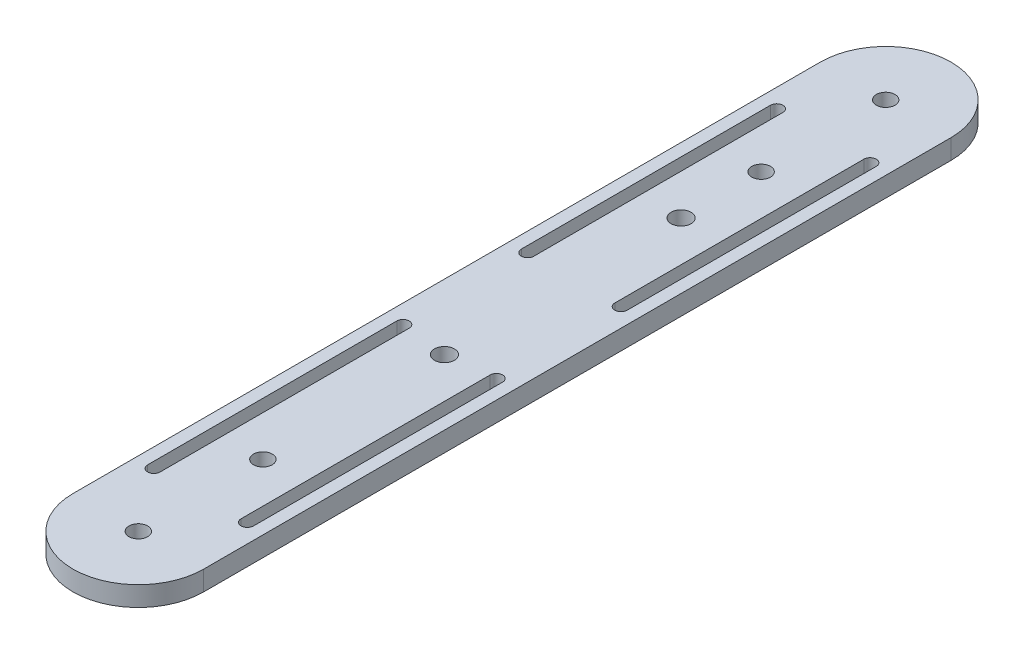
ISO-10303-21;
HEADER;
FILE_DESCRIPTION(('STEP AP214'),'2;1');
FILE_NAME('part.step','',(''),(''),'','','');
FILE_SCHEMA(('AUTOMOTIVE_DESIGN { 1 0 10303 214 1 1 1 1 }'));
ENDSEC;
DATA;
#1=APPLICATION_CONTEXT('core data for automotive mechanical design processes');
#2=APPLICATION_PROTOCOL_DEFINITION('international standard','automotive_design',2000,#1);
#3=PRODUCT_CONTEXT('',#1,'mechanical');
#4=PRODUCT('Part','Part','',(#3));
#5=PRODUCT_RELATED_PRODUCT_CATEGORY('part','',(#4));
#6=PRODUCT_DEFINITION_FORMATION('','',#4);
#7=PRODUCT_DEFINITION_CONTEXT('part definition',#1,'design');
#8=PRODUCT_DEFINITION('design','',#6,#7);
#9=PRODUCT_DEFINITION_SHAPE('','',#8);
#10=(LENGTH_UNIT() NAMED_UNIT(*) SI_UNIT(.MILLI.,.METRE.));
#11=(NAMED_UNIT(*) PLANE_ANGLE_UNIT() SI_UNIT($,.RADIAN.));
#12=(NAMED_UNIT(*) SI_UNIT($,.STERADIAN.) SOLID_ANGLE_UNIT());
#13=UNCERTAINTY_MEASURE_WITH_UNIT(LENGTH_MEASURE(1.E-05),#10,'distance_accuracy_value','');
#14=(GEOMETRIC_REPRESENTATION_CONTEXT(3) GLOBAL_UNCERTAINTY_ASSIGNED_CONTEXT((#13)) GLOBAL_UNIT_ASSIGNED_CONTEXT((#10,
#11,#12)) REPRESENTATION_CONTEXT('',''));
#15=CARTESIAN_POINT('',(0.,0.,0.));
#16=DIRECTION('',(0.,0.,1.));
#17=DIRECTION('',(1.,0.,0.));
#18=AXIS2_PLACEMENT_3D('',#15,#16,#17);
#19=CARTESIAN_POINT('',(0.,3.175,0.));
#20=DIRECTION('',(0.,1.,0.));
#21=DIRECTION('',(0.,0.,1.));
#22=AXIS2_PLACEMENT_3D('',#19,#20,#21);
#23=PLANE('',#22);
#24=CARTESIAN_POINT('',(0.,3.175,70.85));
#25=DIRECTION('',(0.,1.,0.));
#26=DIRECTION('',(0.,0.,1.));
#27=AXIS2_PLACEMENT_3D('',#24,#25,#26);
#28=CIRCLE('',#27,1.6);
#29=CARTESIAN_POINT('',(0.,3.175,72.45));
#30=VERTEX_POINT('',#29);
#31=EDGE_CURVE('E228',#30,#30,#28,.T.);
#32=ORIENTED_EDGE('',*,*,#31,.F.);
#33=EDGE_LOOP('',(#32));
#34=FACE_BOUND('',#33,.T.);
#35=CARTESIAN_POINT('',(0.,3.175,32.85));
#36=DIRECTION('',(0.,1.,0.));
#37=DIRECTION('',(0.,0.,1.));
#38=AXIS2_PLACEMENT_3D('',#35,#36,#37);
#39=CIRCLE('',#38,1.6);
#40=CARTESIAN_POINT('',(0.,3.175,34.45));
#41=VERTEX_POINT('',#40);
#42=EDGE_CURVE('E481',#41,#41,#39,.T.);
#43=ORIENTED_EDGE('',*,*,#42,.F.);
#44=EDGE_LOOP('',(#43));
#45=FACE_BOUND('',#44,.T.);
#46=CARTESIAN_POINT('',(-7.50000000000002,3.175,70.));
#47=DIRECTION('',(0.,1.,0.));
#48=DIRECTION('',(0.,0.,1.));
#49=AXIS2_PLACEMENT_3D('',#46,#47,#48);
#50=CIRCLE('',#49,0.999999999999999);
#51=CARTESIAN_POINT('',(-6.5,3.175,70.));
#52=VERTEX_POINT('',#51);
#53=CARTESIAN_POINT('',(-8.5,3.175,70.));
#54=VERTEX_POINT('',#53);
#55=EDGE_CURVE('E292',#52,#54,#50,.T.);
#56=ORIENTED_EDGE('',*,*,#55,.F.);
#57=DIRECTION('',(0.,0.,-1.));
#58=VECTOR('',#57,1.);
#59=CARTESIAN_POINT('',(-6.5,3.175,0.));
#60=LINE('',#59,#58);
#61=CARTESIAN_POINT('',(-6.5,3.175,110.));
#62=VERTEX_POINT('',#61);
#63=EDGE_CURVE('E286',#62,#52,#60,.T.);
#64=ORIENTED_EDGE('',*,*,#63,.F.);
#65=CARTESIAN_POINT('',(-7.50000000000013,3.175,110.));
#66=DIRECTION('',(0.,1.,0.));
#67=DIRECTION('',(0.,0.,1.));
#68=AXIS2_PLACEMENT_3D('',#65,#66,#67);
#69=CIRCLE('',#68,0.999999999999999);
#70=CARTESIAN_POINT('',(-8.50000000000013,3.175,110.));
#71=VERTEX_POINT('',#70);
#72=EDGE_CURVE('E288',#71,#62,#69,.T.);
#73=ORIENTED_EDGE('',*,*,#72,.F.);
#74=DIRECTION('',(0.,0.,1.));
#75=VECTOR('',#74,1.);
#76=CARTESIAN_POINT('',(-8.5,3.175,0.));
#77=LINE('',#76,#75);
#78=EDGE_CURVE('E290',#54,#71,#77,.T.);
#79=ORIENTED_EDGE('',*,*,#78,.F.);
#80=EDGE_LOOP('',(#56,#64,#73,#79));
#81=FACE_BOUND('',#80,.T.);
#82=CARTESIAN_POINT('',(7.49999999999986,3.175,110.));
#83=DIRECTION('',(0.,1.,0.));
#84=DIRECTION('',(0.,0.,1.));
#85=AXIS2_PLACEMENT_3D('',#82,#83,#84);
#86=CIRCLE('',#85,0.999999999999999);
#87=CARTESIAN_POINT('',(6.5,3.175,110.));
#88=VERTEX_POINT('',#87);
#89=CARTESIAN_POINT('',(8.5,3.175,110.));
#90=VERTEX_POINT('',#89);
#91=EDGE_CURVE('E284',#88,#90,#86,.T.);
#92=ORIENTED_EDGE('',*,*,#91,.F.);
#93=DIRECTION('',(0.,0.,1.));
#94=VECTOR('',#93,1.);
#95=CARTESIAN_POINT('',(6.5,3.175,0.));
#96=LINE('',#95,#94);
#97=CARTESIAN_POINT('',(6.5,3.175,70.));
#98=VERTEX_POINT('',#97);
#99=EDGE_CURVE('E278',#98,#88,#96,.T.);
#100=ORIENTED_EDGE('',*,*,#99,.F.);
#101=CARTESIAN_POINT('',(7.49999999999997,3.175,70.));
#102=DIRECTION('',(0.,1.,0.));
#103=DIRECTION('',(0.,0.,1.));
#104=AXIS2_PLACEMENT_3D('',#101,#102,#103);
#105=CIRCLE('',#104,0.999999999999999);
#106=CARTESIAN_POINT('',(8.5,3.175,70.));
#107=VERTEX_POINT('',#106);
#108=EDGE_CURVE('E280',#107,#98,#105,.T.);
#109=ORIENTED_EDGE('',*,*,#108,.F.);
#110=DIRECTION('',(0.,0.,-1.));
#111=VECTOR('',#110,1.);
#112=CARTESIAN_POINT('',(8.5,3.175,0.));
#113=LINE('',#112,#111);
#114=EDGE_CURVE('E282',#90,#107,#113,.T.);
#115=ORIENTED_EDGE('',*,*,#114,.F.);
#116=EDGE_LOOP('',(#92,#100,#109,#115));
#117=FACE_BOUND('',#116,.T.);
#118=CARTESIAN_POINT('',(7.5,3.175,50.));
#119=DIRECTION('',(0.,1.,0.));
#120=DIRECTION('',(0.,0.,1.));
#121=AXIS2_PLACEMENT_3D('',#118,#119,#120);
#122=CIRCLE('',#121,0.999999999999999);
#123=CARTESIAN_POINT('',(6.5,3.175,50.));
#124=VERTEX_POINT('',#123);
#125=CARTESIAN_POINT('',(8.5,3.175,50.));
#126=VERTEX_POINT('',#125);
#127=EDGE_CURVE('E276',#124,#126,#122,.T.);
#128=ORIENTED_EDGE('',*,*,#127,.F.);
#129=DIRECTION('',(0.,0.,1.));
#130=VECTOR('',#129,1.);
#131=CARTESIAN_POINT('',(6.5,3.175,0.));
#132=LINE('',#131,#130);
#133=CARTESIAN_POINT('',(6.5,3.175,9.99999999999999));
#134=VERTEX_POINT('',#133);
#135=EDGE_CURVE('E271',#134,#124,#132,.T.);
#136=ORIENTED_EDGE('',*,*,#135,.F.);
#137=CARTESIAN_POINT('',(7.5,3.175,10.));
#138=DIRECTION('',(0.,1.,0.));
#139=DIRECTION('',(0.,0.,1.));
#140=AXIS2_PLACEMENT_3D('',#137,#138,#139);
#141=CIRCLE('',#140,0.999999999999999);
#142=CARTESIAN_POINT('',(8.49999999999999,3.175,10.));
#143=VERTEX_POINT('',#142);
#144=EDGE_CURVE('E178',#143,#134,#141,.T.);
#145=ORIENTED_EDGE('',*,*,#144,.F.);
#146=DIRECTION('',(0.,0.,-1.));
#147=VECTOR('',#146,1.);
#148=CARTESIAN_POINT('',(8.5,3.175,0.));
#149=LINE('',#148,#147);
#150=EDGE_CURVE('E274',#126,#143,#149,.T.);
#151=ORIENTED_EDGE('',*,*,#150,.F.);
#152=EDGE_LOOP('',(#128,#136,#145,#151));
#153=FACE_BOUND('',#152,.T.);
#154=CARTESIAN_POINT('',(-7.5,3.175,50.));
#155=DIRECTION('',(0.,1.,0.));
#156=DIRECTION('',(0.,0.,1.));
#157=AXIS2_PLACEMENT_3D('',#154,#155,#156);
#158=CIRCLE('',#157,0.999999999999999);
#159=CARTESIAN_POINT('',(-8.5,3.175,50.));
#160=VERTEX_POINT('',#159);
#161=CARTESIAN_POINT('',(-6.5,3.175,50.));
#162=VERTEX_POINT('',#161);
#163=EDGE_CURVE('E269',#160,#162,#158,.T.);
#164=ORIENTED_EDGE('',*,*,#163,.F.);
#165=DIRECTION('',(0.,0.,1.));
#166=VECTOR('',#165,1.);
#167=CARTESIAN_POINT('',(-8.5,3.175,0.));
#168=LINE('',#167,#166);
#169=CARTESIAN_POINT('',(-8.5,3.175,10.));
#170=VERTEX_POINT('',#169);
#171=EDGE_CURVE('E256',#170,#160,#168,.T.);
#172=ORIENTED_EDGE('',*,*,#171,.F.);
#173=CARTESIAN_POINT('',(-7.5,3.175,10.));
#174=DIRECTION('',(0.,1.,0.));
#175=DIRECTION('',(0.,0.,1.));
#176=AXIS2_PLACEMENT_3D('',#173,#174,#175);
#177=CIRCLE('',#176,0.999999999999999);
#178=CARTESIAN_POINT('',(-6.5,3.175,9.99999999999999));
#179=VERTEX_POINT('',#178);
#180=EDGE_CURVE('E264',#179,#170,#177,.T.);
#181=ORIENTED_EDGE('',*,*,#180,.F.);
#182=DIRECTION('',(0.,0.,-1.));
#183=VECTOR('',#182,1.);
#184=CARTESIAN_POINT('',(-6.5,3.175,0.));
#185=LINE('',#184,#183);
#186=EDGE_CURVE('E267',#162,#179,#185,.T.);
#187=ORIENTED_EDGE('',*,*,#186,.F.);
#188=EDGE_LOOP('',(#164,#172,#181,#187));
#189=FACE_BOUND('',#188,.T.);
#190=CARTESIAN_POINT('',(0.,3.175,100.));
#191=DIRECTION('',(0.,1.,0.));
#192=DIRECTION('',(0.,0.,1.));
#193=AXIS2_PLACEMENT_3D('',#190,#191,#192);
#194=CIRCLE('',#193,1.5);
#195=CARTESIAN_POINT('',(0.,3.175,101.5));
#196=VERTEX_POINT('',#195);
#197=EDGE_CURVE('E297',#196,#196,#194,.T.);
#198=ORIENTED_EDGE('',*,*,#197,.F.);
#199=EDGE_LOOP('',(#198));
#200=FACE_BOUND('',#199,.T.);
#201=CARTESIAN_POINT('',(-1.43479954023023E-10,3.175,20.0000000000062));
#202=DIRECTION('',(0.,-1.,0.));
#203=DIRECTION('',(0.,0.,-1.));
#204=AXIS2_PLACEMENT_3D('',#201,#202,#203);
#205=CIRCLE('',#204,1.5);
#206=CARTESIAN_POINT('',(-1.43479954023023E-10,3.175,18.5000000000062));
#207=VERTEX_POINT('',#206);
#208=EDGE_CURVE('E300',#207,#207,#205,.T.);
#209=ORIENTED_EDGE('',*,*,#208,.T.);
#210=EDGE_LOOP('',(#209));
#211=FACE_BOUND('',#210,.T.);
#212=CARTESIAN_POINT('',(0.,3.175,0.));
#213=DIRECTION('',(0.,1.,0.));
#214=DIRECTION('',(0.,0.,1.));
#215=AXIS2_PLACEMENT_3D('',#212,#213,#214);
#216=CIRCLE('',#215,1.5);
#217=CARTESIAN_POINT('',(0.,3.175,1.5));
#218=VERTEX_POINT('',#217);
#219=EDGE_CURVE('E310',#218,#218,#216,.T.);
#220=ORIENTED_EDGE('',*,*,#219,.F.);
#221=EDGE_LOOP('',(#220));
#222=FACE_BOUND('',#221,.T.);
#223=CARTESIAN_POINT('',(0.,3.175,0.));
#224=DIRECTION('',(0.,1.,0.));
#225=DIRECTION('',(0.,0.,1.));
#226=AXIS2_PLACEMENT_3D('',#223,#224,#225);
#227=CIRCLE('',#226,10.5);
#228=CARTESIAN_POINT('',(10.5,3.175,0.));
#229=VERTEX_POINT('',#228);
#230=CARTESIAN_POINT('',(-10.5,3.175,0.));
#231=VERTEX_POINT('',#230);
#232=EDGE_CURVE('E316',#229,#231,#227,.T.);
#233=ORIENTED_EDGE('',*,*,#232,.T.);
#234=DIRECTION('',(0.,0.,1.));
#235=VECTOR('',#234,1.);
#236=CARTESIAN_POINT('',(-10.5,3.175,0.));
#237=LINE('',#236,#235);
#238=CARTESIAN_POINT('',(-10.5,3.175,120.));
#239=VERTEX_POINT('',#238);
#240=EDGE_CURVE('E319',#231,#239,#237,.T.);
#241=ORIENTED_EDGE('',*,*,#240,.T.);
#242=CARTESIAN_POINT('',(0.,3.175,120.));
#243=DIRECTION('',(0.,1.,0.));
#244=DIRECTION('',(0.,0.,1.));
#245=AXIS2_PLACEMENT_3D('',#242,#243,#244);
#246=CIRCLE('',#245,10.5);
#247=CARTESIAN_POINT('',(10.5,3.175,120.));
#248=VERTEX_POINT('',#247);
#249=EDGE_CURVE('E322',#239,#248,#246,.T.);
#250=ORIENTED_EDGE('',*,*,#249,.T.);
#251=DIRECTION('',(0.,0.,-1.));
#252=VECTOR('',#251,1.);
#253=CARTESIAN_POINT('',(10.5,3.175,0.));
#254=LINE('',#253,#252);
#255=EDGE_CURVE('E324',#248,#229,#254,.T.);
#256=ORIENTED_EDGE('',*,*,#255,.T.);
#257=EDGE_LOOP('',(#233,#241,#250,#256));
#258=FACE_BOUND('',#257,.T.);
#259=CARTESIAN_POINT('',(0.,3.175,120.));
#260=DIRECTION('',(0.,1.,0.));
#261=DIRECTION('',(0.,0.,1.));
#262=AXIS2_PLACEMENT_3D('',#259,#260,#261);
#263=CIRCLE('',#262,1.5);
#264=CARTESIAN_POINT('',(0.,3.175,121.5));
#265=VERTEX_POINT('',#264);
#266=EDGE_CURVE('E303',#265,#265,#263,.T.);
#267=ORIENTED_EDGE('',*,*,#266,.F.);
#268=EDGE_LOOP('',(#267));
#269=FACE_BOUND('',#268,.T.);
#270=ADVANCED_FACE('F32',(#34,#45,#81,#117,#153,#189,#200,#211,#222,#258,#269),#23,.T.);
#271=CARTESIAN_POINT('',(0.,0.,0.));
#272=DIRECTION('',(0.,1.,0.));
#273=DIRECTION('',(0.,0.,1.));
#274=AXIS2_PLACEMENT_3D('',#271,#272,#273);
#275=PLANE('',#274);
#276=CARTESIAN_POINT('',(0.,0.,70.85));
#277=DIRECTION('',(0.,-1.,0.));
#278=DIRECTION('',(0.,0.,-1.));
#279=AXIS2_PLACEMENT_3D('',#276,#277,#278);
#280=CIRCLE('',#279,1.6);
#281=CARTESIAN_POINT('',(0.,0.,69.25));
#282=VERTEX_POINT('',#281);
#283=EDGE_CURVE('E480',#282,#282,#280,.T.);
#284=ORIENTED_EDGE('',*,*,#283,.F.);
#285=EDGE_LOOP('',(#284));
#286=FACE_BOUND('',#285,.T.);
#287=CARTESIAN_POINT('',(0.,0.,32.85));
#288=DIRECTION('',(0.,-1.,0.));
#289=DIRECTION('',(0.,0.,-1.));
#290=AXIS2_PLACEMENT_3D('',#287,#288,#289);
#291=CIRCLE('',#290,1.6);
#292=CARTESIAN_POINT('',(0.,0.,31.25));
#293=VERTEX_POINT('',#292);
#294=EDGE_CURVE('E482',#293,#293,#291,.T.);
#295=ORIENTED_EDGE('',*,*,#294,.F.);
#296=EDGE_LOOP('',(#295));
#297=FACE_BOUND('',#296,.T.);
#298=DIRECTION('',(0.,0.,1.));
#299=VECTOR('',#298,1.);
#300=CARTESIAN_POINT('',(-6.5,0.,70.));
#301=LINE('',#300,#299);
#302=CARTESIAN_POINT('',(-6.5,0.,70.));
#303=VERTEX_POINT('',#302);
#304=CARTESIAN_POINT('',(-6.5,0.,110.));
#305=VERTEX_POINT('',#304);
#306=EDGE_CURVE('E227',#303,#305,#301,.T.);
#307=ORIENTED_EDGE('',*,*,#306,.F.);
#308=CARTESIAN_POINT('',(-7.50000000000002,0.,70.));
#309=DIRECTION('',(0.,-1.,0.));
#310=DIRECTION('',(0.,0.,1.));
#311=AXIS2_PLACEMENT_3D('',#308,#309,#310);
#312=CIRCLE('',#311,0.999999999999999);
#313=CARTESIAN_POINT('',(-8.5,0.,70.));
#314=VERTEX_POINT('',#313);
#315=EDGE_CURVE('E225',#314,#303,#312,.T.);
#316=ORIENTED_EDGE('',*,*,#315,.F.);
#317=DIRECTION('',(0.,0.,-1.));
#318=VECTOR('',#317,1.);
#319=CARTESIAN_POINT('',(-8.5,0.,110.));
#320=LINE('',#319,#318);
#321=CARTESIAN_POINT('',(-8.50000000000013,0.,110.));
#322=VERTEX_POINT('',#321);
#323=EDGE_CURVE('E233',#322,#314,#320,.T.);
#324=ORIENTED_EDGE('',*,*,#323,.F.);
#325=CARTESIAN_POINT('',(-7.50000000000013,0.,110.));
#326=DIRECTION('',(0.,-1.,0.));
#327=DIRECTION('',(0.,0.,1.));
#328=AXIS2_PLACEMENT_3D('',#325,#326,#327);
#329=CIRCLE('',#328,0.999999999999999);
#330=EDGE_CURVE('E230',#305,#322,#329,.T.);
#331=ORIENTED_EDGE('',*,*,#330,.F.);
#332=EDGE_LOOP('',(#307,#316,#324,#331));
#333=FACE_BOUND('',#332,.T.);
#334=DIRECTION('',(0.,0.,-1.));
#335=VECTOR('',#334,1.);
#336=CARTESIAN_POINT('',(6.5,0.,70.));
#337=LINE('',#336,#335);
#338=CARTESIAN_POINT('',(6.5,0.,110.));
#339=VERTEX_POINT('',#338);
#340=CARTESIAN_POINT('',(6.49999999999997,0.,70.));
#341=VERTEX_POINT('',#340);
#342=EDGE_CURVE('E208',#339,#341,#337,.T.);
#343=ORIENTED_EDGE('',*,*,#342,.F.);
#344=CARTESIAN_POINT('',(7.49999999999986,0.,110.));
#345=DIRECTION('',(0.,-1.,0.));
#346=DIRECTION('',(0.,0.,-1.));
#347=AXIS2_PLACEMENT_3D('',#344,#345,#346);
#348=CIRCLE('',#347,0.999999999999999);
#349=CARTESIAN_POINT('',(8.5,0.,110.));
#350=VERTEX_POINT('',#349);
#351=EDGE_CURVE('E206',#350,#339,#348,.T.);
#352=ORIENTED_EDGE('',*,*,#351,.F.);
#353=DIRECTION('',(0.,0.,1.));
#354=VECTOR('',#353,1.);
#355=CARTESIAN_POINT('',(8.5,0.,110.));
#356=LINE('',#355,#354);
#357=CARTESIAN_POINT('',(8.5,0.,70.));
#358=VERTEX_POINT('',#357);
#359=EDGE_CURVE('E214',#358,#350,#356,.T.);
#360=ORIENTED_EDGE('',*,*,#359,.F.);
#361=CARTESIAN_POINT('',(7.49999999999997,0.,70.));
#362=DIRECTION('',(0.,-1.,0.));
#363=DIRECTION('',(0.,0.,-1.));
#364=AXIS2_PLACEMENT_3D('',#361,#362,#363);
#365=CIRCLE('',#364,0.999999999999999);
#366=EDGE_CURVE('E211',#341,#358,#365,.T.);
#367=ORIENTED_EDGE('',*,*,#366,.F.);
#368=EDGE_LOOP('',(#343,#352,#360,#367));
#369=FACE_BOUND('',#368,.T.);
#370=DIRECTION('',(0.,0.,-1.));
#371=VECTOR('',#370,1.);
#372=CARTESIAN_POINT('',(6.5,0.,50.));
#373=LINE('',#372,#371);
#374=CARTESIAN_POINT('',(6.5,0.,50.));
#375=VERTEX_POINT('',#374);
#376=CARTESIAN_POINT('',(6.5,0.,9.99999999999999));
#377=VERTEX_POINT('',#376);
#378=EDGE_CURVE('E186',#375,#377,#373,.T.);
#379=ORIENTED_EDGE('',*,*,#378,.F.);
#380=CARTESIAN_POINT('',(7.5,0.,50.));
#381=DIRECTION('',(0.,-1.,0.));
#382=DIRECTION('',(0.,0.,1.));
#383=AXIS2_PLACEMENT_3D('',#380,#381,#382);
#384=CIRCLE('',#383,0.999999999999999);
#385=CARTESIAN_POINT('',(8.5,0.,50.));
#386=VERTEX_POINT('',#385);
#387=EDGE_CURVE('E191',#386,#375,#384,.T.);
#388=ORIENTED_EDGE('',*,*,#387,.F.);
#389=DIRECTION('',(0.,0.,1.));
#390=VECTOR('',#389,1.);
#391=CARTESIAN_POINT('',(8.5,0.,10.));
#392=LINE('',#391,#390);
#393=CARTESIAN_POINT('',(8.49999999999999,0.,10.));
#394=VERTEX_POINT('',#393);
#395=EDGE_CURVE('E196',#394,#386,#392,.T.);
#396=ORIENTED_EDGE('',*,*,#395,.F.);
#397=CARTESIAN_POINT('',(7.5,0.,10.));
#398=DIRECTION('',(0.,-1.,0.));
#399=DIRECTION('',(0.,0.,1.));
#400=AXIS2_PLACEMENT_3D('',#397,#398,#399);
#401=CIRCLE('',#400,0.999999999999999);
#402=EDGE_CURVE('E175',#377,#394,#401,.T.);
#403=ORIENTED_EDGE('',*,*,#402,.F.);
#404=EDGE_LOOP('',(#379,#388,#396,#403));
#405=FACE_BOUND('',#404,.T.);
#406=DIRECTION('',(0.,0.,-1.));
#407=VECTOR('',#406,1.);
#408=CARTESIAN_POINT('',(-8.5,0.,10.));
#409=LINE('',#408,#407);
#410=CARTESIAN_POINT('',(-8.5,0.,50.));
#411=VERTEX_POINT('',#410);
#412=CARTESIAN_POINT('',(-8.5,0.,10.));
#413=VERTEX_POINT('',#412);
#414=EDGE_CURVE('E244',#411,#413,#409,.T.);
#415=ORIENTED_EDGE('',*,*,#414,.F.);
#416=CARTESIAN_POINT('',(-7.5,0.,50.));
#417=DIRECTION('',(0.,-1.,0.));
#418=DIRECTION('',(0.,0.,-1.));
#419=AXIS2_PLACEMENT_3D('',#416,#417,#418);
#420=CIRCLE('',#419,0.999999999999999);
#421=CARTESIAN_POINT('',(-6.5,0.,50.));
#422=VERTEX_POINT('',#421);
#423=EDGE_CURVE('E203',#422,#411,#420,.T.);
#424=ORIENTED_EDGE('',*,*,#423,.F.);
#425=DIRECTION('',(0.,0.,1.));
#426=VECTOR('',#425,1.);
#427=CARTESIAN_POINT('',(-6.5,0.,50.));
#428=LINE('',#427,#426);
#429=CARTESIAN_POINT('',(-6.5,0.,9.99999999999999));
#430=VERTEX_POINT('',#429);
#431=EDGE_CURVE('E250',#430,#422,#428,.T.);
#432=ORIENTED_EDGE('',*,*,#431,.F.);
#433=CARTESIAN_POINT('',(-7.5,0.,10.));
#434=DIRECTION('',(0.,-1.,0.));
#435=DIRECTION('',(0.,0.,-1.));
#436=AXIS2_PLACEMENT_3D('',#433,#434,#435);
#437=CIRCLE('',#436,0.999999999999999);
#438=EDGE_CURVE('E247',#413,#430,#437,.T.);
#439=ORIENTED_EDGE('',*,*,#438,.F.);
#440=EDGE_LOOP('',(#415,#424,#432,#439));
#441=FACE_BOUND('',#440,.T.);
#442=CARTESIAN_POINT('',(0.,0.,100.));
#443=DIRECTION('',(0.,1.,0.));
#444=DIRECTION('',(0.,0.,1.));
#445=AXIS2_PLACEMENT_3D('',#442,#443,#444);
#446=CIRCLE('',#445,1.5);
#447=CARTESIAN_POINT('',(0.,0.,101.5));
#448=VERTEX_POINT('',#447);
#449=EDGE_CURVE('E294',#448,#448,#446,.T.);
#450=ORIENTED_EDGE('',*,*,#449,.T.);
#451=EDGE_LOOP('',(#450));
#452=FACE_BOUND('',#451,.T.);
#453=CARTESIAN_POINT('',(-1.43479954023023E-10,0.,20.0000000000062));
#454=DIRECTION('',(0.,1.,0.));
#455=DIRECTION('',(0.,0.,1.));
#456=AXIS2_PLACEMENT_3D('',#453,#454,#455);
#457=CIRCLE('',#456,1.5);
#458=CARTESIAN_POINT('',(-1.43479954023023E-10,0.,21.5000000000062));
#459=VERTEX_POINT('',#458);
#460=EDGE_CURVE('E36',#459,#459,#457,.T.);
#461=ORIENTED_EDGE('',*,*,#460,.T.);
#462=EDGE_LOOP('',(#461));
#463=FACE_BOUND('',#462,.T.);
#464=CARTESIAN_POINT('',(0.,0.,0.));
#465=DIRECTION('',(0.,1.,0.));
#466=DIRECTION('',(0.,0.,1.));
#467=AXIS2_PLACEMENT_3D('',#464,#465,#466);
#468=CIRCLE('',#467,10.5);
#469=CARTESIAN_POINT('',(10.5,0.,0.));
#470=VERTEX_POINT('',#469);
#471=CARTESIAN_POINT('',(-10.5,0.,0.));
#472=VERTEX_POINT('',#471);
#473=EDGE_CURVE('E313',#470,#472,#468,.T.);
#474=ORIENTED_EDGE('',*,*,#473,.F.);
#475=DIRECTION('',(0.,0.,-1.));
#476=VECTOR('',#475,1.);
#477=CARTESIAN_POINT('',(10.5,0.,0.));
#478=LINE('',#477,#476);
#479=CARTESIAN_POINT('',(10.5,0.,120.));
#480=VERTEX_POINT('',#479);
#481=EDGE_CURVE('E320',#480,#470,#478,.T.);
#482=ORIENTED_EDGE('',*,*,#481,.F.);
#483=CARTESIAN_POINT('',(0.,0.,120.));
#484=DIRECTION('',(0.,1.,0.));
#485=DIRECTION('',(0.,0.,1.));
#486=AXIS2_PLACEMENT_3D('',#483,#484,#485);
#487=CIRCLE('',#486,10.5);
#488=CARTESIAN_POINT('',(-10.5,0.,120.));
#489=VERTEX_POINT('',#488);
#490=EDGE_CURVE('E331',#489,#480,#487,.T.);
#491=ORIENTED_EDGE('',*,*,#490,.F.);
#492=DIRECTION('',(0.,0.,1.));
#493=VECTOR('',#492,1.);
#494=CARTESIAN_POINT('',(-10.5,0.,0.));
#495=LINE('',#494,#493);
#496=EDGE_CURVE('E329',#472,#489,#495,.T.);
#497=ORIENTED_EDGE('',*,*,#496,.F.);
#498=EDGE_LOOP('',(#474,#482,#491,#497));
#499=FACE_BOUND('',#498,.T.);
#500=CARTESIAN_POINT('',(0.,0.,0.));
#501=DIRECTION('',(0.,1.,0.));
#502=DIRECTION('',(0.,0.,1.));
#503=AXIS2_PLACEMENT_3D('',#500,#501,#502);
#504=CIRCLE('',#503,1.5);
#505=CARTESIAN_POINT('',(0.,0.,1.5));
#506=VERTEX_POINT('',#505);
#507=EDGE_CURVE('E306',#506,#506,#504,.T.);
#508=ORIENTED_EDGE('',*,*,#507,.T.);
#509=EDGE_LOOP('',(#508));
#510=FACE_BOUND('',#509,.T.);
#511=CARTESIAN_POINT('',(0.,0.,120.));
#512=DIRECTION('',(0.,1.,0.));
#513=DIRECTION('',(0.,0.,1.));
#514=AXIS2_PLACEMENT_3D('',#511,#512,#513);
#515=CIRCLE('',#514,1.5);
#516=CARTESIAN_POINT('',(0.,0.,121.5));
#517=VERTEX_POINT('',#516);
#518=EDGE_CURVE('E307',#517,#517,#515,.T.);
#519=ORIENTED_EDGE('',*,*,#518,.T.);
#520=EDGE_LOOP('',(#519));
#521=FACE_BOUND('',#520,.T.);
#522=ADVANCED_FACE('F193',(#286,#297,#333,#369,#405,#441,#452,#463,#499,#510,#521),#275,.F.);
#523=CARTESIAN_POINT('',(0.,3.175,0.));
#524=DIRECTION('',(0.,-1.,0.));
#525=DIRECTION('',(0.,0.,-1.));
#526=AXIS2_PLACEMENT_3D('',#523,#524,#525);
#527=CYLINDRICAL_SURFACE('',#526,10.5);
#528=ORIENTED_EDGE('',*,*,#473,.T.);
#529=DIRECTION('',(0.,-1.,0.));
#530=VECTOR('',#529,1.);
#531=CARTESIAN_POINT('',(-10.5,3.175,0.));
#532=LINE('',#531,#530);
#533=EDGE_CURVE('E11',#231,#472,#532,.T.);
#534=ORIENTED_EDGE('',*,*,#533,.F.);
#535=ORIENTED_EDGE('',*,*,#232,.F.);
#536=DIRECTION('',(0.,-1.,0.));
#537=VECTOR('',#536,1.);
#538=CARTESIAN_POINT('',(10.5,3.175,0.));
#539=LINE('',#538,#537);
#540=EDGE_CURVE('E326',#229,#470,#539,.T.);
#541=ORIENTED_EDGE('',*,*,#540,.T.);
#542=EDGE_LOOP('',(#528,#534,#535,#541));
#543=FACE_BOUND('',#542,.T.);
#544=ADVANCED_FACE('F34',(#543),#527,.T.);
#545=CARTESIAN_POINT('',(-10.5,3.175,0.));
#546=DIRECTION('',(1.,0.,0.));
#547=DIRECTION('',(0.,0.,-1.));
#548=AXIS2_PLACEMENT_3D('',#545,#546,#547);
#549=PLANE('',#548);
#550=ORIENTED_EDGE('',*,*,#496,.T.);
#551=DIRECTION('',(0.,-1.,0.));
#552=VECTOR('',#551,1.);
#553=CARTESIAN_POINT('',(-10.5,3.175,120.));
#554=LINE('',#553,#552);
#555=EDGE_CURVE('E41',#239,#489,#554,.T.);
#556=ORIENTED_EDGE('',*,*,#555,.F.);
#557=ORIENTED_EDGE('',*,*,#240,.F.);
#558=ORIENTED_EDGE('',*,*,#533,.T.);
#559=EDGE_LOOP('',(#550,#556,#557,#558));
#560=FACE_BOUND('',#559,.T.);
#561=ADVANCED_FACE('F360',(#560),#549,.F.);
#562=CARTESIAN_POINT('',(0.,3.175,120.));
#563=DIRECTION('',(0.,-1.,0.));
#564=DIRECTION('',(0.,0.,-1.));
#565=AXIS2_PLACEMENT_3D('',#562,#563,#564);
#566=CYLINDRICAL_SURFACE('',#565,10.5);
#567=ORIENTED_EDGE('',*,*,#490,.T.);
#568=DIRECTION('',(0.,-1.,0.));
#569=VECTOR('',#568,1.);
#570=CARTESIAN_POINT('',(10.5,3.175,120.));
#571=LINE('',#570,#569);
#572=EDGE_CURVE('E336',#248,#480,#571,.T.);
#573=ORIENTED_EDGE('',*,*,#572,.F.);
#574=ORIENTED_EDGE('',*,*,#249,.F.);
#575=ORIENTED_EDGE('',*,*,#555,.T.);
#576=EDGE_LOOP('',(#567,#573,#574,#575));
#577=FACE_BOUND('',#576,.T.);
#578=ADVANCED_FACE('F344',(#577),#566,.T.);
#579=CARTESIAN_POINT('',(10.5,3.175,0.));
#580=DIRECTION('',(-1.,0.,0.));
#581=DIRECTION('',(0.,0.,1.));
#582=AXIS2_PLACEMENT_3D('',#579,#580,#581);
#583=PLANE('',#582);
#584=ORIENTED_EDGE('',*,*,#481,.T.);
#585=ORIENTED_EDGE('',*,*,#540,.F.);
#586=ORIENTED_EDGE('',*,*,#255,.F.);
#587=ORIENTED_EDGE('',*,*,#572,.T.);
#588=EDGE_LOOP('',(#584,#585,#586,#587));
#589=FACE_BOUND('',#588,.T.);
#590=ADVANCED_FACE('F353',(#589),#583,.F.);
#591=CARTESIAN_POINT('',(0.,3.175,0.));
#592=DIRECTION('',(0.,-1.,0.));
#593=DIRECTION('',(0.,0.,-1.));
#594=AXIS2_PLACEMENT_3D('',#591,#592,#593);
#595=CYLINDRICAL_SURFACE('',#594,1.5);
#596=ORIENTED_EDGE('',*,*,#219,.T.);
#597=EDGE_LOOP('',(#596));
#598=FACE_BOUND('',#597,.T.);
#599=ORIENTED_EDGE('',*,*,#507,.F.);
#600=EDGE_LOOP('',(#599));
#601=FACE_BOUND('',#600,.T.);
#602=ADVANCED_FACE('F378',(#598,#601),#595,.F.);
#603=CARTESIAN_POINT('',(0.,3.175,120.));
#604=DIRECTION('',(0.,-1.,0.));
#605=DIRECTION('',(0.,0.,-1.));
#606=AXIS2_PLACEMENT_3D('',#603,#604,#605);
#607=CYLINDRICAL_SURFACE('',#606,1.5);
#608=ORIENTED_EDGE('',*,*,#266,.T.);
#609=EDGE_LOOP('',(#608));
#610=FACE_BOUND('',#609,.T.);
#611=ORIENTED_EDGE('',*,*,#518,.F.);
#612=EDGE_LOOP('',(#611));
#613=FACE_BOUND('',#612,.T.);
#614=ADVANCED_FACE('F385',(#610,#613),#607,.F.);
#615=CARTESIAN_POINT('',(-1.43479954023023E-10,3.175,20.0000000000062));
#616=DIRECTION('',(0.,-1.,0.));
#617=DIRECTION('',(0.,0.,-1.));
#618=AXIS2_PLACEMENT_3D('',#615,#616,#617);
#619=CYLINDRICAL_SURFACE('',#618,1.5);
#620=ORIENTED_EDGE('',*,*,#208,.F.);
#621=EDGE_LOOP('',(#620));
#622=FACE_BOUND('',#621,.T.);
#623=ORIENTED_EDGE('',*,*,#460,.F.);
#624=EDGE_LOOP('',(#623));
#625=FACE_BOUND('',#624,.T.);
#626=ADVANCED_FACE('F390',(#622,#625),#619,.F.);
#627=CARTESIAN_POINT('',(0.,0.,100.));
#628=DIRECTION('',(0.,1.,0.));
#629=DIRECTION('',(0.,0.,1.));
#630=AXIS2_PLACEMENT_3D('',#627,#628,#629);
#631=CYLINDRICAL_SURFACE('',#630,1.5);
#632=ORIENTED_EDGE('',*,*,#197,.T.);
#633=EDGE_LOOP('',(#632));
#634=FACE_BOUND('',#633,.T.);
#635=ORIENTED_EDGE('',*,*,#449,.F.);
#636=EDGE_LOOP('',(#635));
#637=FACE_BOUND('',#636,.T.);
#638=ADVANCED_FACE('F402',(#634,#637),#631,.F.);
#639=CARTESIAN_POINT('',(-7.5,40.,50.));
#640=DIRECTION('',(0.,-1.,0.));
#641=DIRECTION('',(0.,0.,-1.));
#642=AXIS2_PLACEMENT_3D('',#639,#640,#641);
#643=CYLINDRICAL_SURFACE('',#642,0.999999999999999);
#644=ORIENTED_EDGE('',*,*,#163,.T.);
#645=DIRECTION('',(0.,-1.,0.));
#646=VECTOR('',#645,1.);
#647=CARTESIAN_POINT('',(-6.5,40.,50.));
#648=LINE('',#647,#646);
#649=EDGE_CURVE('E254',#162,#422,#648,.T.);
#650=ORIENTED_EDGE('',*,*,#649,.T.);
#651=ORIENTED_EDGE('',*,*,#423,.T.);
#652=DIRECTION('',(0.,-1.,0.));
#653=VECTOR('',#652,1.);
#654=CARTESIAN_POINT('',(-8.5,40.,50.));
#655=LINE('',#654,#653);
#656=EDGE_CURVE('E253',#160,#411,#655,.T.);
#657=ORIENTED_EDGE('',*,*,#656,.F.);
#658=EDGE_LOOP('',(#644,#650,#651,#657));
#659=FACE_BOUND('',#658,.T.);
#660=ADVANCED_FACE('F408',(#659),#643,.F.);
#661=CARTESIAN_POINT('',(-6.5,40.,50.));
#662=DIRECTION('',(1.,0.,0.));
#663=DIRECTION('',(0.,0.,-1.));
#664=AXIS2_PLACEMENT_3D('',#661,#662,#663);
#665=PLANE('',#664);
#666=ORIENTED_EDGE('',*,*,#186,.T.);
#667=DIRECTION('',(0.,-1.,0.));
#668=VECTOR('',#667,1.);
#669=CARTESIAN_POINT('',(-6.5,40.,9.99999999999999));
#670=LINE('',#669,#668);
#671=EDGE_CURVE('E257',#179,#430,#670,.T.);
#672=ORIENTED_EDGE('',*,*,#671,.T.);
#673=ORIENTED_EDGE('',*,*,#431,.T.);
#674=ORIENTED_EDGE('',*,*,#649,.F.);
#675=EDGE_LOOP('',(#666,#672,#673,#674));
#676=FACE_BOUND('',#675,.T.);
#677=ADVANCED_FACE('F412',(#676),#665,.F.);
#678=CARTESIAN_POINT('',(-7.5,40.,10.));
#679=DIRECTION('',(0.,-1.,0.));
#680=DIRECTION('',(0.,0.,-1.));
#681=AXIS2_PLACEMENT_3D('',#678,#679,#680);
#682=CYLINDRICAL_SURFACE('',#681,0.999999999999999);
#683=ORIENTED_EDGE('',*,*,#180,.T.);
#684=DIRECTION('',(0.,-1.,0.));
#685=VECTOR('',#684,1.);
#686=CARTESIAN_POINT('',(-8.5,40.,10.));
#687=LINE('',#686,#685);
#688=EDGE_CURVE('E259',#170,#413,#687,.T.);
#689=ORIENTED_EDGE('',*,*,#688,.T.);
#690=ORIENTED_EDGE('',*,*,#438,.T.);
#691=ORIENTED_EDGE('',*,*,#671,.F.);
#692=EDGE_LOOP('',(#683,#689,#690,#691));
#693=FACE_BOUND('',#692,.T.);
#694=ADVANCED_FACE('F418',(#693),#682,.F.);
#695=CARTESIAN_POINT('',(-8.5,40.,10.));
#696=DIRECTION('',(-1.,0.,0.));
#697=DIRECTION('',(0.,0.,1.));
#698=AXIS2_PLACEMENT_3D('',#695,#696,#697);
#699=PLANE('',#698);
#700=ORIENTED_EDGE('',*,*,#171,.T.);
#701=ORIENTED_EDGE('',*,*,#656,.T.);
#702=ORIENTED_EDGE('',*,*,#414,.T.);
#703=ORIENTED_EDGE('',*,*,#688,.F.);
#704=EDGE_LOOP('',(#700,#701,#702,#703));
#705=FACE_BOUND('',#704,.T.);
#706=ADVANCED_FACE('F414',(#705),#699,.F.);
#707=CARTESIAN_POINT('',(7.5,40.,50.));
#708=DIRECTION('',(0.,-1.,0.));
#709=DIRECTION('',(0.,0.,-1.));
#710=AXIS2_PLACEMENT_3D('',#707,#708,#709);
#711=CYLINDRICAL_SURFACE('',#710,0.999999999999999);
#712=ORIENTED_EDGE('',*,*,#127,.T.);
#713=DIRECTION('',(0.,-1.,0.));
#714=VECTOR('',#713,1.);
#715=CARTESIAN_POINT('',(8.5,40.,50.));
#716=LINE('',#715,#714);
#717=EDGE_CURVE('E201',#126,#386,#716,.T.);
#718=ORIENTED_EDGE('',*,*,#717,.T.);
#719=ORIENTED_EDGE('',*,*,#387,.T.);
#720=DIRECTION('',(0.,-1.,0.));
#721=VECTOR('',#720,1.);
#722=CARTESIAN_POINT('',(6.5,40.,50.));
#723=LINE('',#722,#721);
#724=EDGE_CURVE('E182',#124,#375,#723,.T.);
#725=ORIENTED_EDGE('',*,*,#724,.F.);
#726=EDGE_LOOP('',(#712,#718,#719,#725));
#727=FACE_BOUND('',#726,.T.);
#728=ADVANCED_FACE('F417',(#727),#711,.F.);
#729=CARTESIAN_POINT('',(8.5,40.,10.));
#730=DIRECTION('',(1.,0.,0.));
#731=DIRECTION('',(0.,0.,-1.));
#732=AXIS2_PLACEMENT_3D('',#729,#730,#731);
#733=PLANE('',#732);
#734=ORIENTED_EDGE('',*,*,#150,.T.);
#735=DIRECTION('',(0.,-1.,0.));
#736=VECTOR('',#735,1.);
#737=CARTESIAN_POINT('',(8.49999999999999,40.,10.));
#738=LINE('',#737,#736);
#739=EDGE_CURVE('E181',#143,#394,#738,.T.);
#740=ORIENTED_EDGE('',*,*,#739,.T.);
#741=ORIENTED_EDGE('',*,*,#395,.T.);
#742=ORIENTED_EDGE('',*,*,#717,.F.);
#743=EDGE_LOOP('',(#734,#740,#741,#742));
#744=FACE_BOUND('',#743,.T.);
#745=ADVANCED_FACE('F459',(#744),#733,.F.);
#746=CARTESIAN_POINT('',(7.5,40.,10.));
#747=DIRECTION('',(0.,-1.,0.));
#748=DIRECTION('',(0.,0.,-1.));
#749=AXIS2_PLACEMENT_3D('',#746,#747,#748);
#750=CYLINDRICAL_SURFACE('',#749,0.999999999999999);
#751=ORIENTED_EDGE('',*,*,#144,.T.);
#752=DIRECTION('',(0.,-1.,0.));
#753=VECTOR('',#752,1.);
#754=CARTESIAN_POINT('',(6.5,40.,9.99999999999999));
#755=LINE('',#754,#753);
#756=EDGE_CURVE('E170',#134,#377,#755,.T.);
#757=ORIENTED_EDGE('',*,*,#756,.T.);
#758=ORIENTED_EDGE('',*,*,#402,.T.);
#759=ORIENTED_EDGE('',*,*,#739,.F.);
#760=EDGE_LOOP('',(#751,#757,#758,#759));
#761=FACE_BOUND('',#760,.T.);
#762=ADVANCED_FACE('F172',(#761),#750,.F.);
#763=CARTESIAN_POINT('',(6.5,40.,50.));
#764=DIRECTION('',(-1.,0.,0.));
#765=DIRECTION('',(0.,0.,1.));
#766=AXIS2_PLACEMENT_3D('',#763,#764,#765);
#767=PLANE('',#766);
#768=ORIENTED_EDGE('',*,*,#135,.T.);
#769=ORIENTED_EDGE('',*,*,#724,.T.);
#770=ORIENTED_EDGE('',*,*,#378,.T.);
#771=ORIENTED_EDGE('',*,*,#756,.F.);
#772=EDGE_LOOP('',(#768,#769,#770,#771));
#773=FACE_BOUND('',#772,.T.);
#774=ADVANCED_FACE('F187',(#773),#767,.F.);
#775=CARTESIAN_POINT('',(7.49999999999986,40.,110.));
#776=DIRECTION('',(0.,-1.,0.));
#777=DIRECTION('',(0.,0.,-1.));
#778=AXIS2_PLACEMENT_3D('',#775,#776,#777);
#779=CYLINDRICAL_SURFACE('',#778,0.999999999999999);
#780=ORIENTED_EDGE('',*,*,#91,.T.);
#781=DIRECTION('',(0.,-1.,0.));
#782=VECTOR('',#781,1.);
#783=CARTESIAN_POINT('',(8.5,40.,110.));
#784=LINE('',#783,#782);
#785=EDGE_CURVE('E218',#90,#350,#784,.T.);
#786=ORIENTED_EDGE('',*,*,#785,.T.);
#787=ORIENTED_EDGE('',*,*,#351,.T.);
#788=DIRECTION('',(0.,-1.,0.));
#789=VECTOR('',#788,1.);
#790=CARTESIAN_POINT('',(6.5,40.,110.));
#791=LINE('',#790,#789);
#792=EDGE_CURVE('E217',#88,#339,#791,.T.);
#793=ORIENTED_EDGE('',*,*,#792,.F.);
#794=EDGE_LOOP('',(#780,#786,#787,#793));
#795=FACE_BOUND('',#794,.T.);
#796=ADVANCED_FACE('F443',(#795),#779,.F.);
#797=CARTESIAN_POINT('',(8.5,40.,110.));
#798=DIRECTION('',(1.,0.,0.));
#799=DIRECTION('',(0.,0.,-1.));
#800=AXIS2_PLACEMENT_3D('',#797,#798,#799);
#801=PLANE('',#800);
#802=ORIENTED_EDGE('',*,*,#114,.T.);
#803=DIRECTION('',(0.,-1.,0.));
#804=VECTOR('',#803,1.);
#805=CARTESIAN_POINT('',(8.5,40.,70.));
#806=LINE('',#805,#804);
#807=EDGE_CURVE('E220',#107,#358,#806,.T.);
#808=ORIENTED_EDGE('',*,*,#807,.T.);
#809=ORIENTED_EDGE('',*,*,#359,.T.);
#810=ORIENTED_EDGE('',*,*,#785,.F.);
#811=EDGE_LOOP('',(#802,#808,#809,#810));
#812=FACE_BOUND('',#811,.T.);
#813=ADVANCED_FACE('F446',(#812),#801,.F.);
#814=CARTESIAN_POINT('',(7.49999999999997,40.,70.));
#815=DIRECTION('',(0.,-1.,0.));
#816=DIRECTION('',(0.,0.,-1.));
#817=AXIS2_PLACEMENT_3D('',#814,#815,#816);
#818=CYLINDRICAL_SURFACE('',#817,0.999999999999999);
#819=ORIENTED_EDGE('',*,*,#108,.T.);
#820=DIRECTION('',(0.,-1.,0.));
#821=VECTOR('',#820,1.);
#822=CARTESIAN_POINT('',(6.49999999999997,40.,70.));
#823=LINE('',#822,#821);
#824=EDGE_CURVE('E56',#98,#341,#823,.T.);
#825=ORIENTED_EDGE('',*,*,#824,.T.);
#826=ORIENTED_EDGE('',*,*,#366,.T.);
#827=ORIENTED_EDGE('',*,*,#807,.F.);
#828=EDGE_LOOP('',(#819,#825,#826,#827));
#829=FACE_BOUND('',#828,.T.);
#830=ADVANCED_FACE('F450',(#829),#818,.F.);
#831=CARTESIAN_POINT('',(6.5,40.,70.));
#832=DIRECTION('',(-1.,0.,0.));
#833=DIRECTION('',(0.,0.,1.));
#834=AXIS2_PLACEMENT_3D('',#831,#832,#833);
#835=PLANE('',#834);
#836=ORIENTED_EDGE('',*,*,#99,.T.);
#837=ORIENTED_EDGE('',*,*,#792,.T.);
#838=ORIENTED_EDGE('',*,*,#342,.T.);
#839=ORIENTED_EDGE('',*,*,#824,.F.);
#840=EDGE_LOOP('',(#836,#837,#838,#839));
#841=FACE_BOUND('',#840,.T.);
#842=ADVANCED_FACE('F430',(#841),#835,.F.);
#843=CARTESIAN_POINT('',(-7.50000000000002,40.,70.));
#844=DIRECTION('',(0.,-1.,0.));
#845=DIRECTION('',(0.,0.,-1.));
#846=AXIS2_PLACEMENT_3D('',#843,#844,#845);
#847=CYLINDRICAL_SURFACE('',#846,0.999999999999999);
#848=ORIENTED_EDGE('',*,*,#55,.T.);
#849=DIRECTION('',(0.,-1.,0.));
#850=VECTOR('',#849,1.);
#851=CARTESIAN_POINT('',(-8.5,40.,70.));
#852=LINE('',#851,#850);
#853=EDGE_CURVE('E209',#54,#314,#852,.T.);
#854=ORIENTED_EDGE('',*,*,#853,.T.);
#855=ORIENTED_EDGE('',*,*,#315,.T.);
#856=DIRECTION('',(0.,-1.,0.));
#857=VECTOR('',#856,1.);
#858=CARTESIAN_POINT('',(-6.5,40.,70.));
#859=LINE('',#858,#857);
#860=EDGE_CURVE('E236',#52,#303,#859,.T.);
#861=ORIENTED_EDGE('',*,*,#860,.F.);
#862=EDGE_LOOP('',(#848,#854,#855,#861));
#863=FACE_BOUND('',#862,.T.);
#864=ADVANCED_FACE('F426',(#863),#847,.F.);
#865=CARTESIAN_POINT('',(-8.5,40.,110.));
#866=DIRECTION('',(-1.,0.,0.));
#867=DIRECTION('',(0.,0.,1.));
#868=AXIS2_PLACEMENT_3D('',#865,#866,#867);
#869=PLANE('',#868);
#870=ORIENTED_EDGE('',*,*,#78,.T.);
#871=DIRECTION('',(0.,-1.,0.));
#872=VECTOR('',#871,1.);
#873=CARTESIAN_POINT('',(-8.50000000000013,40.,110.));
#874=LINE('',#873,#872);
#875=EDGE_CURVE('E238',#71,#322,#874,.T.);
#876=ORIENTED_EDGE('',*,*,#875,.T.);
#877=ORIENTED_EDGE('',*,*,#323,.T.);
#878=ORIENTED_EDGE('',*,*,#853,.F.);
#879=EDGE_LOOP('',(#870,#876,#877,#878));
#880=FACE_BOUND('',#879,.T.);
#881=ADVANCED_FACE('F429',(#880),#869,.F.);
#882=CARTESIAN_POINT('',(-7.50000000000013,40.,110.));
#883=DIRECTION('',(0.,-1.,0.));
#884=DIRECTION('',(0.,0.,-1.));
#885=AXIS2_PLACEMENT_3D('',#882,#883,#884);
#886=CYLINDRICAL_SURFACE('',#885,0.999999999999999);
#887=ORIENTED_EDGE('',*,*,#72,.T.);
#888=DIRECTION('',(0.,-1.,0.));
#889=VECTOR('',#888,1.);
#890=CARTESIAN_POINT('',(-6.5,40.,110.));
#891=LINE('',#890,#889);
#892=EDGE_CURVE('E48',#62,#305,#891,.T.);
#893=ORIENTED_EDGE('',*,*,#892,.T.);
#894=ORIENTED_EDGE('',*,*,#330,.T.);
#895=ORIENTED_EDGE('',*,*,#875,.F.);
#896=EDGE_LOOP('',(#887,#893,#894,#895));
#897=FACE_BOUND('',#896,.T.);
#898=ADVANCED_FACE('F436',(#897),#886,.F.);
#899=CARTESIAN_POINT('',(-6.5,40.,70.));
#900=DIRECTION('',(1.,0.,0.));
#901=DIRECTION('',(0.,0.,-1.));
#902=AXIS2_PLACEMENT_3D('',#899,#900,#901);
#903=PLANE('',#902);
#904=ORIENTED_EDGE('',*,*,#63,.T.);
#905=ORIENTED_EDGE('',*,*,#860,.T.);
#906=ORIENTED_EDGE('',*,*,#306,.T.);
#907=ORIENTED_EDGE('',*,*,#892,.F.);
#908=EDGE_LOOP('',(#904,#905,#906,#907));
#909=FACE_BOUND('',#908,.T.);
#910=ADVANCED_FACE('F432',(#909),#903,.F.);
#911=CARTESIAN_POINT('',(0.,10.,32.85));
#912=DIRECTION('',(0.,-1.,0.));
#913=DIRECTION('',(0.,0.,-1.));
#914=AXIS2_PLACEMENT_3D('',#911,#912,#913);
#915=CYLINDRICAL_SURFACE('',#914,1.6);
#916=ORIENTED_EDGE('',*,*,#42,.T.);
#917=EDGE_LOOP('',(#916));
#918=FACE_BOUND('',#917,.T.);
#919=ORIENTED_EDGE('',*,*,#294,.T.);
#920=EDGE_LOOP('',(#919));
#921=FACE_BOUND('',#920,.T.);
#922=ADVANCED_FACE('F435',(#918,#921),#915,.F.);
#923=CARTESIAN_POINT('',(0.,10.,70.85));
#924=DIRECTION('',(0.,-1.,0.));
#925=DIRECTION('',(0.,0.,-1.));
#926=AXIS2_PLACEMENT_3D('',#923,#924,#925);
#927=CYLINDRICAL_SURFACE('',#926,1.6);
#928=ORIENTED_EDGE('',*,*,#31,.T.);
#929=EDGE_LOOP('',(#928));
#930=FACE_BOUND('',#929,.T.);
#931=ORIENTED_EDGE('',*,*,#283,.T.);
#932=EDGE_LOOP('',(#931));
#933=FACE_BOUND('',#932,.T.);
#934=ADVANCED_FACE('F470',(#930,#933),#927,.F.);
#935=CLOSED_SHELL('',(#270,#522,#544,#561,#578,#590,#602,#614,#626,#638,#660,#677,#694,#706,
#728,#745,#762,#774,#796,#813,#830,#842,#864,#881,#898,#910,#922,#934));
#936=MANIFOLD_SOLID_BREP('B2',#935);
#937=ADVANCED_BREP_SHAPE_REPRESENTATION('',(#18,#936),#14);
#938=SHAPE_DEFINITION_REPRESENTATION(#9,#937);
ENDSEC;
END-ISO-10303-21;
